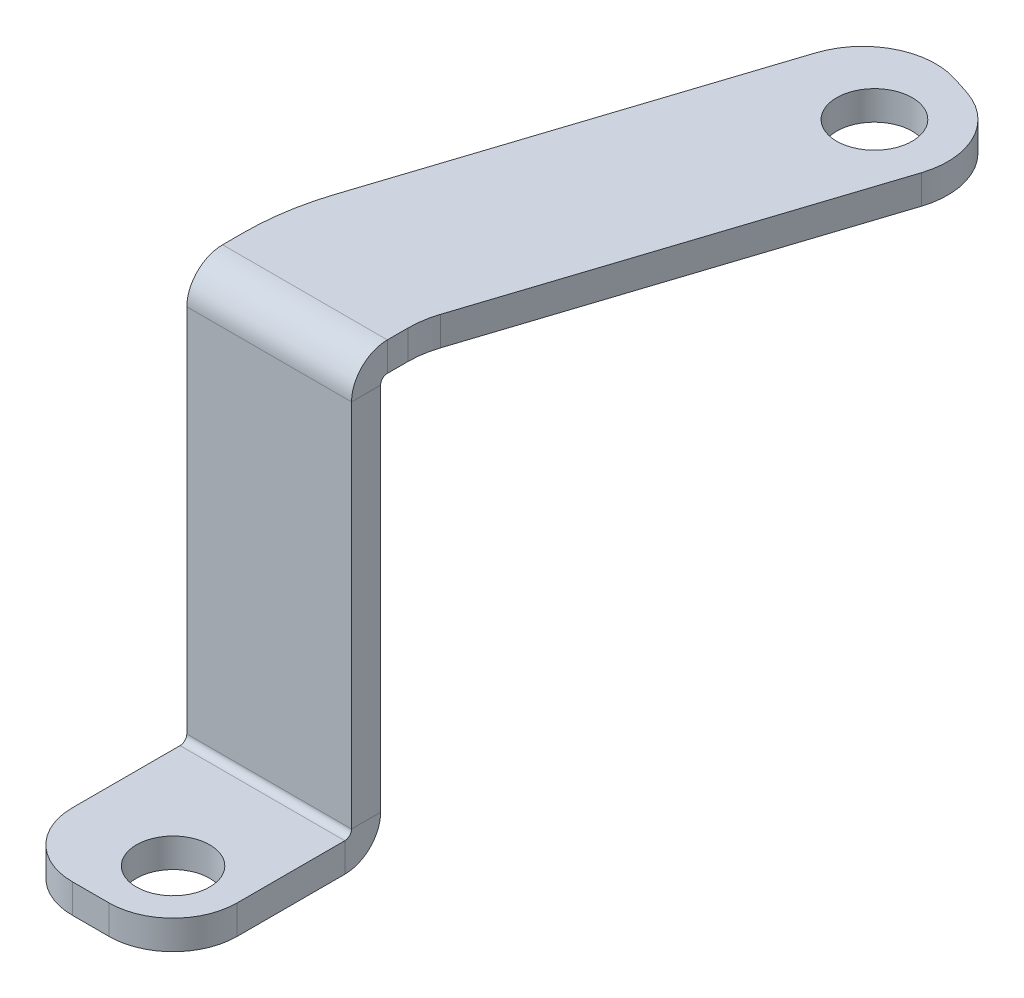
ISO-10303-21;
HEADER;
FILE_DESCRIPTION(('STEP AP214'),'2;1');
FILE_NAME('part.step','',(''),(''),'','','');
FILE_SCHEMA(('AUTOMOTIVE_DESIGN { 1 0 10303 214 1 1 1 1 }'));
ENDSEC;
DATA;
#1=APPLICATION_CONTEXT('core data for automotive mechanical design processes');
#2=APPLICATION_PROTOCOL_DEFINITION('international standard','automotive_design',2000,#1);
#3=PRODUCT_CONTEXT('',#1,'mechanical');
#4=PRODUCT('Part','Part','',(#3));
#5=PRODUCT_RELATED_PRODUCT_CATEGORY('part','',(#4));
#6=PRODUCT_DEFINITION_FORMATION('','',#4);
#7=PRODUCT_DEFINITION_CONTEXT('part definition',#1,'design');
#8=PRODUCT_DEFINITION('design','',#6,#7);
#9=PRODUCT_DEFINITION_SHAPE('','',#8);
#10=(LENGTH_UNIT() NAMED_UNIT(*) SI_UNIT(.MILLI.,.METRE.));
#11=(NAMED_UNIT(*) PLANE_ANGLE_UNIT() SI_UNIT($,.RADIAN.));
#12=(NAMED_UNIT(*) SI_UNIT($,.STERADIAN.) SOLID_ANGLE_UNIT());
#13=UNCERTAINTY_MEASURE_WITH_UNIT(LENGTH_MEASURE(1.E-05),#10,'distance_accuracy_value','');
#14=(GEOMETRIC_REPRESENTATION_CONTEXT(3) GLOBAL_UNCERTAINTY_ASSIGNED_CONTEXT((#13)) GLOBAL_UNIT_ASSIGNED_CONTEXT((#10,
#11,#12)) REPRESENTATION_CONTEXT('',''));
#15=CARTESIAN_POINT('',(0.,0.,0.));
#16=DIRECTION('',(0.,0.,1.));
#17=DIRECTION('',(1.,0.,0.));
#18=AXIS2_PLACEMENT_3D('',#15,#16,#17);
#19=CARTESIAN_POINT('',(7.,0.,-15.675));
#20=DIRECTION('',(-1.,0.,0.));
#21=DIRECTION('',(0.,0.,1.));
#22=AXIS2_PLACEMENT_3D('',#19,#20,#21);
#23=PLANE('',#22);
#24=DIRECTION('',(0.,0.,1.));
#25=VECTOR('',#24,1.);
#26=CARTESIAN_POINT('',(7.,41.1509000000002,-15.6750000000001));
#27=LINE('',#26,#25);
#28=CARTESIAN_POINT('',(7.,41.1509000000002,-15.6750000000001));
#29=VERTEX_POINT('',#28);
#30=CARTESIAN_POINT('',(7.,41.1509000000002,-12.5000000000001));
#31=VERTEX_POINT('',#30);
#32=EDGE_CURVE('E284',#29,#31,#27,.T.);
#33=ORIENTED_EDGE('',*,*,#32,.T.);
#34=DIRECTION('',(0.,-1.,0.));
#35=VECTOR('',#34,1.);
#36=CARTESIAN_POINT('',(7.,0.,-12.5));
#37=LINE('',#36,#35);
#38=CARTESIAN_POINT('',(7.,0.736599999999989,-12.5));
#39=VERTEX_POINT('',#38);
#40=EDGE_CURVE('E309',#31,#39,#37,.T.);
#41=ORIENTED_EDGE('',*,*,#40,.T.);
#42=DIRECTION('',(0.,0.,-1.));
#43=VECTOR('',#42,1.);
#44=CARTESIAN_POINT('',(7.,0.736599999999997,-12.5));
#45=LINE('',#44,#43);
#46=CARTESIAN_POINT('',(7.,0.736599999999978,-15.675));
#47=VERTEX_POINT('',#46);
#48=EDGE_CURVE('E296',#39,#47,#45,.T.);
#49=ORIENTED_EDGE('',*,*,#48,.T.);
#50=DIRECTION('',(0.,-1.,0.));
#51=VECTOR('',#50,1.);
#52=CARTESIAN_POINT('',(7.,0.,-15.675));
#53=LINE('',#52,#51);
#54=EDGE_CURVE('E310',#29,#47,#53,.T.);
#55=ORIENTED_EDGE('',*,*,#54,.F.);
#56=EDGE_LOOP('',(#33,#41,#49,#55));
#57=FACE_BOUND('',#56,.T.);
#58=ADVANCED_FACE('F43',(#57),#23,.F.);
#59=CARTESIAN_POINT('',(-11.,41.8875000000002,-15.6750000000001));
#60=DIRECTION('',(1.,0.,0.));
#61=DIRECTION('',(0.,1.,0.));
#62=AXIS2_PLACEMENT_3D('',#59,#60,#61);
#63=PLANE('',#62);
#64=DIRECTION('',(0.,0.,1.));
#65=VECTOR('',#64,1.);
#66=CARTESIAN_POINT('',(-11.,41.1509000000002,-15.6750000000001));
#67=LINE('',#66,#65);
#68=CARTESIAN_POINT('',(-11.,41.1509000000002,-15.6750000000001));
#69=VERTEX_POINT('',#68);
#70=CARTESIAN_POINT('',(-11.,41.1509000000002,-12.5000000000001));
#71=VERTEX_POINT('',#70);
#72=EDGE_CURVE('E294',#69,#71,#67,.T.);
#73=ORIENTED_EDGE('',*,*,#72,.F.);
#74=DIRECTION('',(0.,1.,0.));
#75=VECTOR('',#74,1.);
#76=CARTESIAN_POINT('',(-11.,41.8875000000002,-15.6750000000001));
#77=LINE('',#76,#75);
#78=CARTESIAN_POINT('',(-11.,0.736600000000019,-15.675));
#79=VERTEX_POINT('',#78);
#80=EDGE_CURVE('E312',#79,#69,#77,.T.);
#81=ORIENTED_EDGE('',*,*,#80,.F.);
#82=DIRECTION('',(0.,0.,-1.));
#83=VECTOR('',#82,1.);
#84=CARTESIAN_POINT('',(-11.,0.736599999999997,-12.5));
#85=LINE('',#84,#83);
#86=CARTESIAN_POINT('',(-11.,0.736599999999989,-12.5));
#87=VERTEX_POINT('',#86);
#88=EDGE_CURVE('E301',#87,#79,#85,.T.);
#89=ORIENTED_EDGE('',*,*,#88,.F.);
#90=DIRECTION('',(0.,1.,0.));
#91=VECTOR('',#90,1.);
#92=CARTESIAN_POINT('',(-11.,41.8875000000002,-12.5000000000001));
#93=LINE('',#92,#91);
#94=EDGE_CURVE('E313',#87,#71,#93,.T.);
#95=ORIENTED_EDGE('',*,*,#94,.T.);
#96=EDGE_LOOP('',(#73,#81,#89,#95));
#97=FACE_BOUND('',#96,.T.);
#98=ADVANCED_FACE('F410',(#97),#63,.F.);
#99=CARTESIAN_POINT('',(0.,0.,-15.675));
#100=DIRECTION('',(0.,0.,1.));
#101=DIRECTION('',(0.,-1.,0.));
#102=AXIS2_PLACEMENT_3D('',#99,#100,#101);
#103=PLANE('',#102);
#104=DIRECTION('',(1.,0.,0.));
#105=VECTOR('',#104,1.);
#106=CARTESIAN_POINT('',(7.,41.1509000000002,-15.6750000000001));
#107=LINE('',#106,#105);
#108=EDGE_CURVE('E290',#29,#69,#107,.F.);
#109=ORIENTED_EDGE('',*,*,#108,.F.);
#110=ORIENTED_EDGE('',*,*,#54,.T.);
#111=DIRECTION('',(1.,0.,0.));
#112=VECTOR('',#111,1.);
#113=CARTESIAN_POINT('',(0.,0.736600000000019,-15.675));
#114=LINE('',#113,#112);
#115=EDGE_CURVE('E304',#79,#47,#114,.T.);
#116=ORIENTED_EDGE('',*,*,#115,.F.);
#117=ORIENTED_EDGE('',*,*,#80,.T.);
#118=EDGE_LOOP('',(#109,#110,#116,#117));
#119=FACE_BOUND('',#118,.T.);
#120=ADVANCED_FACE('F405',(#119),#103,.F.);
#121=CARTESIAN_POINT('',(0.,0.,-12.5));
#122=DIRECTION('',(0.,0.,1.));
#123=DIRECTION('',(0.,-1.,0.));
#124=AXIS2_PLACEMENT_3D('',#121,#122,#123);
#125=PLANE('',#124);
#126=ORIENTED_EDGE('',*,*,#40,.F.);
#127=DIRECTION('',(1.,0.,0.));
#128=VECTOR('',#127,1.);
#129=CARTESIAN_POINT('',(7.,41.1509000000002,-12.5000000000001));
#130=LINE('',#129,#128);
#131=EDGE_CURVE('E279',#31,#71,#130,.F.);
#132=ORIENTED_EDGE('',*,*,#131,.T.);
#133=ORIENTED_EDGE('',*,*,#94,.F.);
#134=DIRECTION('',(-1.,0.,0.));
#135=VECTOR('',#134,1.);
#136=CARTESIAN_POINT('',(7.,0.736599999999997,-12.5));
#137=LINE('',#136,#135);
#138=EDGE_CURVE('E299',#39,#87,#137,.T.);
#139=ORIENTED_EDGE('',*,*,#138,.F.);
#140=EDGE_LOOP('',(#126,#132,#133,#139));
#141=FACE_BOUND('',#140,.T.);
#142=ADVANCED_FACE('F417',(#141),#125,.T.);
#143=CARTESIAN_POINT('',(-11.,-3.175,0.));
#144=DIRECTION('',(-1.,0.,0.));
#145=DIRECTION('',(0.,0.,1.));
#146=AXIS2_PLACEMENT_3D('',#143,#144,#145);
#147=PLANE('',#146);
#148=DIRECTION('',(0.,0.,1.));
#149=VECTOR('',#148,1.);
#150=CARTESIAN_POINT('',(-11.,0.,0.));
#151=LINE('',#150,#149);
#152=CARTESIAN_POINT('',(-11.,0.,-11.7634));
#153=VERTEX_POINT('',#152);
#154=CARTESIAN_POINT('',(-11.,0.,0.));
#155=VERTEX_POINT('',#154);
#156=EDGE_CURVE('E366',#153,#155,#151,.T.);
#157=ORIENTED_EDGE('',*,*,#156,.F.);
#158=DIRECTION('',(0.,-1.,0.));
#159=VECTOR('',#158,1.);
#160=CARTESIAN_POINT('',(-11.,0.,-11.7634));
#161=LINE('',#160,#159);
#162=CARTESIAN_POINT('',(-11.,-3.17500000000001,-11.7634));
#163=VERTEX_POINT('',#162);
#164=EDGE_CURVE('E326',#153,#163,#161,.T.);
#165=ORIENTED_EDGE('',*,*,#164,.T.);
#166=DIRECTION('',(0.,0.,1.));
#167=VECTOR('',#166,1.);
#168=CARTESIAN_POINT('',(-11.,-3.175,0.));
#169=LINE('',#168,#167);
#170=CARTESIAN_POINT('',(-11.,-3.175,0.));
#171=VERTEX_POINT('',#170);
#172=EDGE_CURVE('E354',#163,#171,#169,.T.);
#173=ORIENTED_EDGE('',*,*,#172,.T.);
#174=DIRECTION('',(0.,1.,0.));
#175=VECTOR('',#174,1.);
#176=CARTESIAN_POINT('',(-11.,-3.175,0.));
#177=LINE('',#176,#175);
#178=EDGE_CURVE('E373',#171,#155,#177,.T.);
#179=ORIENTED_EDGE('',*,*,#178,.T.);
#180=EDGE_LOOP('',(#157,#165,#173,#179));
#181=FACE_BOUND('',#180,.T.);
#182=ADVANCED_FACE('F432',(#181),#147,.T.);
#183=CARTESIAN_POINT('',(0.,-3.175,0.));
#184=DIRECTION('',(0.,1.,0.));
#185=DIRECTION('',(0.,0.,1.));
#186=AXIS2_PLACEMENT_3D('',#183,#184,#185);
#187=PLANE('',#186);
#188=CARTESIAN_POINT('',(0.,-3.175,0.));
#189=DIRECTION('',(0.,1.,0.));
#190=DIRECTION('',(0.,0.,1.));
#191=AXIS2_PLACEMENT_3D('',#188,#189,#190);
#192=CIRCLE('',#191,4.);
#193=CARTESIAN_POINT('',(0.,-3.175,4.));
#194=VERTEX_POINT('',#193);
#195=EDGE_CURVE('E341',#194,#194,#192,.T.);
#196=ORIENTED_EDGE('',*,*,#195,.T.);
#197=EDGE_LOOP('',(#196));
#198=FACE_BOUND('',#197,.T.);
#199=DIRECTION('',(-1.,0.,0.));
#200=VECTOR('',#199,1.);
#201=CARTESIAN_POINT('',(-11.,-3.17500000000001,-11.7634));
#202=LINE('',#201,#200);
#203=CARTESIAN_POINT('',(7.,-3.175,-11.7634));
#204=VERTEX_POINT('',#203);
#205=EDGE_CURVE('E320',#163,#204,#202,.F.);
#206=ORIENTED_EDGE('',*,*,#205,.T.);
#207=DIRECTION('',(0.,0.,-1.));
#208=VECTOR('',#207,1.);
#209=CARTESIAN_POINT('',(7.,-3.175,0.));
#210=LINE('',#209,#208);
#211=CARTESIAN_POINT('',(7.,-3.175,0.));
#212=VERTEX_POINT('',#211);
#213=EDGE_CURVE('E350',#212,#204,#210,.T.);
#214=ORIENTED_EDGE('',*,*,#213,.F.);
#215=CARTESIAN_POINT('',(0.,-3.175,0.));
#216=DIRECTION('',(0.,1.,0.));
#217=DIRECTION('',(0.,0.,1.));
#218=AXIS2_PLACEMENT_3D('',#215,#216,#217);
#219=CIRCLE('',#218,7.);
#220=CARTESIAN_POINT('',(0.,-3.175,7.));
#221=VERTEX_POINT('',#220);
#222=EDGE_CURVE('E347',#221,#212,#219,.T.);
#223=ORIENTED_EDGE('',*,*,#222,.F.);
#224=DIRECTION('',(1.,0.,0.));
#225=VECTOR('',#224,1.);
#226=CARTESIAN_POINT('',(0.,-3.175,7.));
#227=LINE('',#226,#225);
#228=CARTESIAN_POINT('',(-4.,-3.175,7.));
#229=VERTEX_POINT('',#228);
#230=EDGE_CURVE('E359',#229,#221,#227,.T.);
#231=ORIENTED_EDGE('',*,*,#230,.F.);
#232=CARTESIAN_POINT('',(-4.,-3.175,0.));
#233=DIRECTION('',(0.,1.,0.));
#234=DIRECTION('',(0.,0.,-1.));
#235=AXIS2_PLACEMENT_3D('',#232,#233,#234);
#236=CIRCLE('',#235,7.);
#237=EDGE_CURVE('E356',#171,#229,#236,.T.);
#238=ORIENTED_EDGE('',*,*,#237,.F.);
#239=ORIENTED_EDGE('',*,*,#172,.F.);
#240=EDGE_LOOP('',(#206,#214,#223,#231,#238,#239));
#241=FACE_BOUND('',#240,.T.);
#242=ADVANCED_FACE('F391',(#198,#241),#187,.F.);
#243=CARTESIAN_POINT('',(0.,0.,0.));
#244=DIRECTION('',(0.,1.,0.));
#245=DIRECTION('',(0.,0.,1.));
#246=AXIS2_PLACEMENT_3D('',#243,#244,#245);
#247=PLANE('',#246);
#248=CARTESIAN_POINT('',(0.,0.,0.));
#249=DIRECTION('',(0.,1.,0.));
#250=DIRECTION('',(0.,0.,1.));
#251=AXIS2_PLACEMENT_3D('',#248,#249,#250);
#252=CIRCLE('',#251,4.);
#253=CARTESIAN_POINT('',(0.,0.,4.));
#254=VERTEX_POINT('',#253);
#255=EDGE_CURVE('E338',#254,#254,#252,.T.);
#256=ORIENTED_EDGE('',*,*,#255,.F.);
#257=EDGE_LOOP('',(#256));
#258=FACE_BOUND('',#257,.T.);
#259=DIRECTION('',(0.,0.,-1.));
#260=VECTOR('',#259,1.);
#261=CARTESIAN_POINT('',(7.,0.,0.));
#262=LINE('',#261,#260);
#263=CARTESIAN_POINT('',(7.,0.,0.));
#264=VERTEX_POINT('',#263);
#265=CARTESIAN_POINT('',(7.,0.,-11.7634));
#266=VERTEX_POINT('',#265);
#267=EDGE_CURVE('E364',#264,#266,#262,.T.);
#268=ORIENTED_EDGE('',*,*,#267,.T.);
#269=DIRECTION('',(-1.,0.,0.));
#270=VECTOR('',#269,1.);
#271=CARTESIAN_POINT('',(-11.,0.,-11.7634));
#272=LINE('',#271,#270);
#273=EDGE_CURVE('E68',#153,#266,#272,.F.);
#274=ORIENTED_EDGE('',*,*,#273,.F.);
#275=ORIENTED_EDGE('',*,*,#156,.T.);
#276=CARTESIAN_POINT('',(-4.,0.,0.));
#277=DIRECTION('',(0.,1.,0.));
#278=DIRECTION('',(0.,0.,-1.));
#279=AXIS2_PLACEMENT_3D('',#276,#277,#278);
#280=CIRCLE('',#279,7.);
#281=CARTESIAN_POINT('',(-4.,0.,7.));
#282=VERTEX_POINT('',#281);
#283=EDGE_CURVE('E368',#155,#282,#280,.T.);
#284=ORIENTED_EDGE('',*,*,#283,.T.);
#285=DIRECTION('',(1.,0.,0.));
#286=VECTOR('',#285,1.);
#287=CARTESIAN_POINT('',(0.,0.,7.));
#288=LINE('',#287,#286);
#289=CARTESIAN_POINT('',(0.,0.,7.));
#290=VERTEX_POINT('',#289);
#291=EDGE_CURVE('E351',#282,#290,#288,.T.);
#292=ORIENTED_EDGE('',*,*,#291,.T.);
#293=CARTESIAN_POINT('',(0.,0.,0.));
#294=DIRECTION('',(0.,1.,0.));
#295=DIRECTION('',(0.,0.,1.));
#296=AXIS2_PLACEMENT_3D('',#293,#294,#295);
#297=CIRCLE('',#296,7.);
#298=EDGE_CURVE('E344',#290,#264,#297,.T.);
#299=ORIENTED_EDGE('',*,*,#298,.T.);
#300=EDGE_LOOP('',(#268,#274,#275,#284,#292,#299));
#301=FACE_BOUND('',#300,.T.);
#302=ADVANCED_FACE('F385',(#258,#301),#247,.T.);
#303=CARTESIAN_POINT('',(0.,-3.175,0.));
#304=DIRECTION('',(0.,1.,0.));
#305=DIRECTION('',(0.,0.,1.));
#306=AXIS2_PLACEMENT_3D('',#303,#304,#305);
#307=CYLINDRICAL_SURFACE('',#306,7.);
#308=ORIENTED_EDGE('',*,*,#298,.F.);
#309=DIRECTION('',(0.,1.,0.));
#310=VECTOR('',#309,1.);
#311=CARTESIAN_POINT('',(0.,-3.175,7.));
#312=LINE('',#311,#310);
#313=EDGE_CURVE('E11',#221,#290,#312,.T.);
#314=ORIENTED_EDGE('',*,*,#313,.F.);
#315=ORIENTED_EDGE('',*,*,#222,.T.);
#316=DIRECTION('',(0.,1.,0.));
#317=VECTOR('',#316,1.);
#318=CARTESIAN_POINT('',(7.,-3.175,0.));
#319=LINE('',#318,#317);
#320=EDGE_CURVE('E47',#212,#264,#319,.T.);
#321=ORIENTED_EDGE('',*,*,#320,.T.);
#322=EDGE_LOOP('',(#308,#314,#315,#321));
#323=FACE_BOUND('',#322,.T.);
#324=ADVANCED_FACE('F45',(#323),#307,.T.);
#325=CARTESIAN_POINT('',(0.,-3.175,7.));
#326=DIRECTION('',(0.,0.,1.));
#327=DIRECTION('',(1.,0.,0.));
#328=AXIS2_PLACEMENT_3D('',#325,#326,#327);
#329=PLANE('',#328);
#330=ORIENTED_EDGE('',*,*,#291,.F.);
#331=DIRECTION('',(0.,1.,0.));
#332=VECTOR('',#331,1.);
#333=CARTESIAN_POINT('',(-4.,-3.175,7.));
#334=LINE('',#333,#332);
#335=EDGE_CURVE('E52',#229,#282,#334,.T.);
#336=ORIENTED_EDGE('',*,*,#335,.F.);
#337=ORIENTED_EDGE('',*,*,#230,.T.);
#338=ORIENTED_EDGE('',*,*,#313,.T.);
#339=EDGE_LOOP('',(#330,#336,#337,#338));
#340=FACE_BOUND('',#339,.T.);
#341=ADVANCED_FACE('F388',(#340),#329,.T.);
#342=CARTESIAN_POINT('',(-4.,-3.175,0.));
#343=DIRECTION('',(0.,1.,0.));
#344=DIRECTION('',(0.,0.,1.));
#345=AXIS2_PLACEMENT_3D('',#342,#343,#344);
#346=CYLINDRICAL_SURFACE('',#345,7.);
#347=ORIENTED_EDGE('',*,*,#283,.F.);
#348=ORIENTED_EDGE('',*,*,#178,.F.);
#349=ORIENTED_EDGE('',*,*,#237,.T.);
#350=ORIENTED_EDGE('',*,*,#335,.T.);
#351=EDGE_LOOP('',(#347,#348,#349,#350));
#352=FACE_BOUND('',#351,.T.);
#353=ADVANCED_FACE('F434',(#352),#346,.T.);
#354=CARTESIAN_POINT('',(7.,-3.175,0.));
#355=DIRECTION('',(1.,0.,0.));
#356=DIRECTION('',(0.,0.,-1.));
#357=AXIS2_PLACEMENT_3D('',#354,#355,#356);
#358=PLANE('',#357);
#359=DIRECTION('',(0.,-1.,0.));
#360=VECTOR('',#359,1.);
#361=CARTESIAN_POINT('',(7.,0.,-11.7634));
#362=LINE('',#361,#360);
#363=EDGE_CURVE('E335',#266,#204,#362,.T.);
#364=ORIENTED_EDGE('',*,*,#363,.F.);
#365=ORIENTED_EDGE('',*,*,#267,.F.);
#366=ORIENTED_EDGE('',*,*,#320,.F.);
#367=ORIENTED_EDGE('',*,*,#213,.T.);
#368=EDGE_LOOP('',(#364,#365,#366,#367));
#369=FACE_BOUND('',#368,.T.);
#370=ADVANCED_FACE('F384',(#369),#358,.T.);
#371=CARTESIAN_POINT('',(0.,-3.175,0.));
#372=DIRECTION('',(0.,1.,0.));
#373=DIRECTION('',(0.,0.,1.));
#374=AXIS2_PLACEMENT_3D('',#371,#372,#373);
#375=CYLINDRICAL_SURFACE('',#374,4.);
#376=ORIENTED_EDGE('',*,*,#195,.F.);
#377=EDGE_LOOP('',(#376));
#378=FACE_BOUND('',#377,.T.);
#379=ORIENTED_EDGE('',*,*,#255,.T.);
#380=EDGE_LOOP('',(#379));
#381=FACE_BOUND('',#380,.T.);
#382=ADVANCED_FACE('F442',(#378,#381),#375,.F.);
#383=CARTESIAN_POINT('',(7.,0.736599999999992,-11.7634));
#384=DIRECTION('',(1.,0.,0.));
#385=DIRECTION('',(0.,0.,-1.));
#386=AXIS2_PLACEMENT_3D('',#383,#384,#385);
#387=PLANE('',#386);
#388=ORIENTED_EDGE('',*,*,#48,.F.);
#389=CARTESIAN_POINT('',(7.,0.736599999999992,-11.7634));
#390=DIRECTION('',(-1.,0.,0.));
#391=DIRECTION('',(0.,0.,1.));
#392=AXIS2_PLACEMENT_3D('',#389,#390,#391);
#393=CIRCLE('',#392,0.7366);
#394=EDGE_CURVE('E329',#266,#39,#393,.F.);
#395=ORIENTED_EDGE('',*,*,#394,.F.);
#396=ORIENTED_EDGE('',*,*,#363,.T.);
#397=CARTESIAN_POINT('',(7.,0.736599999999992,-11.7634));
#398=DIRECTION('',(-1.,0.,0.));
#399=DIRECTION('',(0.,0.,1.));
#400=AXIS2_PLACEMENT_3D('',#397,#398,#399);
#401=CIRCLE('',#400,3.9116);
#402=EDGE_CURVE('E322',#204,#47,#401,.F.);
#403=ORIENTED_EDGE('',*,*,#402,.T.);
#404=EDGE_LOOP('',(#388,#395,#396,#403));
#405=FACE_BOUND('',#404,.T.);
#406=ADVANCED_FACE('F398',(#405),#387,.T.);
#407=CARTESIAN_POINT('',(-11.,0.736599999999992,-11.7634));
#408=DIRECTION('',(1.,0.,0.));
#409=DIRECTION('',(0.,0.,-1.));
#410=AXIS2_PLACEMENT_3D('',#407,#408,#409);
#411=PLANE('',#410);
#412=CARTESIAN_POINT('',(-11.,0.736599999999992,-11.7634));
#413=DIRECTION('',(-1.,0.,0.));
#414=DIRECTION('',(0.,0.,1.));
#415=AXIS2_PLACEMENT_3D('',#412,#413,#414);
#416=CIRCLE('',#415,0.7366);
#417=EDGE_CURVE('E316',#87,#153,#416,.T.);
#418=ORIENTED_EDGE('',*,*,#417,.F.);
#419=ORIENTED_EDGE('',*,*,#88,.T.);
#420=CARTESIAN_POINT('',(-11.,0.736599999999992,-11.7634));
#421=DIRECTION('',(-1.,0.,0.));
#422=DIRECTION('',(0.,0.,1.));
#423=AXIS2_PLACEMENT_3D('',#420,#421,#422);
#424=CIRCLE('',#423,3.9116);
#425=EDGE_CURVE('E323',#79,#163,#424,.T.);
#426=ORIENTED_EDGE('',*,*,#425,.T.);
#427=ORIENTED_EDGE('',*,*,#164,.F.);
#428=EDGE_LOOP('',(#418,#419,#426,#427));
#429=FACE_BOUND('',#428,.T.);
#430=ADVANCED_FACE('F431',(#429),#411,.F.);
#431=CARTESIAN_POINT('',(-11.,0.736599999999992,-11.7634));
#432=DIRECTION('',(-1.,0.,0.));
#433=DIRECTION('',(0.,0.,-1.));
#434=AXIS2_PLACEMENT_3D('',#431,#432,#433);
#435=CYLINDRICAL_SURFACE('',#434,3.9116);
#436=ORIENTED_EDGE('',*,*,#205,.F.);
#437=ORIENTED_EDGE('',*,*,#425,.F.);
#438=ORIENTED_EDGE('',*,*,#115,.T.);
#439=ORIENTED_EDGE('',*,*,#402,.F.);
#440=EDGE_LOOP('',(#436,#437,#438,#439));
#441=FACE_BOUND('',#440,.T.);
#442=ADVANCED_FACE('F400',(#441),#435,.T.);
#443=CARTESIAN_POINT('',(-11.,0.736599999999992,-11.7634));
#444=DIRECTION('',(-1.,0.,0.));
#445=DIRECTION('',(0.,0.,-1.));
#446=AXIS2_PLACEMENT_3D('',#443,#444,#445);
#447=CYLINDRICAL_SURFACE('',#446,0.7366);
#448=ORIENTED_EDGE('',*,*,#273,.T.);
#449=ORIENTED_EDGE('',*,*,#394,.T.);
#450=ORIENTED_EDGE('',*,*,#138,.T.);
#451=ORIENTED_EDGE('',*,*,#417,.T.);
#452=EDGE_LOOP('',(#448,#449,#450,#451));
#453=FACE_BOUND('',#452,.T.);
#454=ADVANCED_FACE('F427',(#453),#447,.F.);
#455=CARTESIAN_POINT('',(-11.,41.1509000000002,-16.4116000000001));
#456=DIRECTION('',(-1.,0.,0.));
#457=DIRECTION('',(0.,0.,1.));
#458=AXIS2_PLACEMENT_3D('',#455,#456,#457);
#459=PLANE('',#458);
#460=DIRECTION('',(0.,1.,0.));
#461=VECTOR('',#460,1.);
#462=CARTESIAN_POINT('',(-11.,41.8875000000002,-16.4116000000001));
#463=LINE('',#462,#461);
#464=CARTESIAN_POINT('',(-11.,41.8875000000002,-16.4116000000001));
#465=VERTEX_POINT('',#464);
#466=CARTESIAN_POINT('',(-11.,45.0625000000002,-16.4116000000001));
#467=VERTEX_POINT('',#466);
#468=EDGE_CURVE('E248',#465,#467,#463,.T.);
#469=ORIENTED_EDGE('',*,*,#468,.F.);
#470=CARTESIAN_POINT('',(-11.,41.1509000000002,-16.4116000000001));
#471=DIRECTION('',(1.,0.,0.));
#472=DIRECTION('',(0.,0.,-1.));
#473=AXIS2_PLACEMENT_3D('',#470,#471,#472);
#474=CIRCLE('',#473,0.736599999999997);
#475=EDGE_CURVE('E287',#69,#465,#474,.F.);
#476=ORIENTED_EDGE('',*,*,#475,.F.);
#477=ORIENTED_EDGE('',*,*,#72,.T.);
#478=CARTESIAN_POINT('',(-11.,41.1509000000002,-16.4116000000001));
#479=DIRECTION('',(1.,0.,0.));
#480=DIRECTION('',(0.,0.,-1.));
#481=AXIS2_PLACEMENT_3D('',#478,#479,#480);
#482=CIRCLE('',#481,3.9116);
#483=EDGE_CURVE('E60',#71,#467,#482,.F.);
#484=ORIENTED_EDGE('',*,*,#483,.T.);
#485=EDGE_LOOP('',(#469,#476,#477,#484));
#486=FACE_BOUND('',#485,.T.);
#487=ADVANCED_FACE('F414',(#486),#459,.T.);
#488=CARTESIAN_POINT('',(7.,41.1509000000002,-16.4116000000001));
#489=DIRECTION('',(-1.,0.,0.));
#490=DIRECTION('',(0.,0.,1.));
#491=AXIS2_PLACEMENT_3D('',#488,#489,#490);
#492=PLANE('',#491);
#493=CARTESIAN_POINT('',(7.,41.1509000000002,-16.4116000000001));
#494=DIRECTION('',(1.,0.,0.));
#495=DIRECTION('',(0.,0.,-1.));
#496=AXIS2_PLACEMENT_3D('',#493,#494,#495);
#497=CIRCLE('',#496,0.736599999999997);
#498=CARTESIAN_POINT('',(7.,41.8875000000002,-16.4116000000001));
#499=VERTEX_POINT('',#498);
#500=EDGE_CURVE('E278',#499,#29,#497,.T.);
#501=ORIENTED_EDGE('',*,*,#500,.F.);
#502=DIRECTION('',(0.,1.,0.));
#503=VECTOR('',#502,1.);
#504=CARTESIAN_POINT('',(7.,41.8875000000002,-16.4116000000001));
#505=LINE('',#504,#503);
#506=CARTESIAN_POINT('',(7.,45.0625000000002,-16.4116000000001));
#507=VERTEX_POINT('',#506);
#508=EDGE_CURVE('E258',#499,#507,#505,.T.);
#509=ORIENTED_EDGE('',*,*,#508,.T.);
#510=CARTESIAN_POINT('',(7.,41.1509000000002,-16.4116000000001));
#511=DIRECTION('',(1.,0.,0.));
#512=DIRECTION('',(0.,0.,-1.));
#513=AXIS2_PLACEMENT_3D('',#510,#511,#512);
#514=CIRCLE('',#513,3.9116);
#515=EDGE_CURVE('E282',#507,#31,#514,.T.);
#516=ORIENTED_EDGE('',*,*,#515,.T.);
#517=ORIENTED_EDGE('',*,*,#32,.F.);
#518=EDGE_LOOP('',(#501,#509,#516,#517));
#519=FACE_BOUND('',#518,.T.);
#520=ADVANCED_FACE('F422',(#519),#492,.F.);
#521=CARTESIAN_POINT('',(7.,41.1509000000002,-16.4116000000001));
#522=DIRECTION('',(1.,0.,0.));
#523=DIRECTION('',(0.,1.,0.));
#524=AXIS2_PLACEMENT_3D('',#521,#522,#523);
#525=CYLINDRICAL_SURFACE('',#524,3.9116);
#526=ORIENTED_EDGE('',*,*,#131,.F.);
#527=ORIENTED_EDGE('',*,*,#515,.F.);
#528=DIRECTION('',(-1.,0.,0.));
#529=VECTOR('',#528,1.);
#530=CARTESIAN_POINT('',(0.,45.0625000000002,-16.4116000000001));
#531=LINE('',#530,#529);
#532=EDGE_CURVE('E261',#507,#467,#531,.T.);
#533=ORIENTED_EDGE('',*,*,#532,.T.);
#534=ORIENTED_EDGE('',*,*,#483,.F.);
#535=EDGE_LOOP('',(#526,#527,#533,#534));
#536=FACE_BOUND('',#535,.T.);
#537=ADVANCED_FACE('F419',(#536),#525,.T.);
#538=CARTESIAN_POINT('',(7.,41.1509000000002,-16.4116000000001));
#539=DIRECTION('',(1.,0.,0.));
#540=DIRECTION('',(0.,1.,0.));
#541=AXIS2_PLACEMENT_3D('',#538,#539,#540);
#542=CYLINDRICAL_SURFACE('',#541,0.736599999999997);
#543=ORIENTED_EDGE('',*,*,#108,.T.);
#544=ORIENTED_EDGE('',*,*,#475,.T.);
#545=DIRECTION('',(1.,0.,0.));
#546=VECTOR('',#545,1.);
#547=CARTESIAN_POINT('',(-11.,41.8875000000002,-16.4116000000001));
#548=LINE('',#547,#546);
#549=EDGE_CURVE('E256',#465,#499,#548,.T.);
#550=ORIENTED_EDGE('',*,*,#549,.T.);
#551=ORIENTED_EDGE('',*,*,#500,.T.);
#552=EDGE_LOOP('',(#543,#544,#550,#551));
#553=FACE_BOUND('',#552,.T.);
#554=ADVANCED_FACE('F600',(#553),#542,.F.);
#555=CARTESIAN_POINT('',(-11.,45.0625000000002,-15.6750000000001));
#556=DIRECTION('',(1.,0.,0.));
#557=DIRECTION('',(0.,0.,-1.));
#558=AXIS2_PLACEMENT_3D('',#555,#556,#557);
#559=PLANE('',#558);
#560=ORIENTED_EDGE('',*,*,#468,.T.);
#561=DIRECTION('',(0.,0.,1.));
#562=VECTOR('',#561,1.);
#563=CARTESIAN_POINT('',(-11.,45.0625000000002,-15.6750000000001));
#564=LINE('',#563,#562);
#565=CARTESIAN_POINT('',(-11.,45.0625000000002,-18.6750000000001));
#566=VERTEX_POINT('',#565);
#567=EDGE_CURVE('E266',#566,#467,#564,.T.);
#568=ORIENTED_EDGE('',*,*,#567,.F.);
#569=DIRECTION('',(0.,-1.,0.));
#570=VECTOR('',#569,1.);
#571=CARTESIAN_POINT('',(-11.,45.0625000000002,-18.6750000000001));
#572=LINE('',#571,#570);
#573=CARTESIAN_POINT('',(-11.,41.8875000000002,-18.6750000000001));
#574=VERTEX_POINT('',#573);
#575=EDGE_CURVE('E272',#566,#574,#572,.T.);
#576=ORIENTED_EDGE('',*,*,#575,.T.);
#577=DIRECTION('',(0.,0.,1.));
#578=VECTOR('',#577,1.);
#579=CARTESIAN_POINT('',(-11.,41.8875000000002,-15.6750000000001));
#580=LINE('',#579,#578);
#581=EDGE_CURVE('E265',#574,#465,#580,.T.);
#582=ORIENTED_EDGE('',*,*,#581,.T.);
#583=EDGE_LOOP('',(#560,#568,#576,#582));
#584=FACE_BOUND('',#583,.T.);
#585=ADVANCED_FACE('F610',(#584),#559,.F.);
#586=CARTESIAN_POINT('',(7.,45.0625000000002,-18.6750000000001));
#587=DIRECTION('',(-1.,0.,0.));
#588=DIRECTION('',(0.,0.,1.));
#589=AXIS2_PLACEMENT_3D('',#586,#587,#588);
#590=PLANE('',#589);
#591=ORIENTED_EDGE('',*,*,#508,.F.);
#592=DIRECTION('',(0.,0.,-1.));
#593=VECTOR('',#592,1.);
#594=CARTESIAN_POINT('',(7.,41.8875000000002,-18.6750000000001));
#595=LINE('',#594,#593);
#596=CARTESIAN_POINT('',(7.,41.8875000000002,-18.6750000000001));
#597=VERTEX_POINT('',#596);
#598=EDGE_CURVE('E270',#499,#597,#595,.T.);
#599=ORIENTED_EDGE('',*,*,#598,.T.);
#600=DIRECTION('',(0.,-1.,0.));
#601=VECTOR('',#600,1.);
#602=CARTESIAN_POINT('',(7.,45.0625000000002,-18.6750000000001));
#603=LINE('',#602,#601);
#604=CARTESIAN_POINT('',(7.,45.0625000000002,-18.6750000000001));
#605=VERTEX_POINT('',#604);
#606=EDGE_CURVE('E209',#605,#597,#603,.T.);
#607=ORIENTED_EDGE('',*,*,#606,.F.);
#608=DIRECTION('',(0.,0.,-1.));
#609=VECTOR('',#608,1.);
#610=CARTESIAN_POINT('',(7.,45.0625000000002,-18.6750000000001));
#611=LINE('',#610,#609);
#612=EDGE_CURVE('E269',#507,#605,#611,.T.);
#613=ORIENTED_EDGE('',*,*,#612,.F.);
#614=EDGE_LOOP('',(#591,#599,#607,#613));
#615=FACE_BOUND('',#614,.T.);
#616=ADVANCED_FACE('F621',(#615),#590,.F.);
#617=CARTESIAN_POINT('',(0.,45.0625000000002,0.));
#618=DIRECTION('',(0.,-1.,0.));
#619=DIRECTION('',(0.,0.,-1.));
#620=AXIS2_PLACEMENT_3D('',#617,#618,#619);
#621=PLANE('',#620);
#622=ORIENTED_EDGE('',*,*,#532,.F.);
#623=ORIENTED_EDGE('',*,*,#612,.T.);
#624=CARTESIAN_POINT('',(16.8624890031223,45.0625000000002,-18.6750000000001));
#625=DIRECTION('',(0.,-1.,0.));
#626=DIRECTION('',(0.,0.,1.));
#627=AXIS2_PLACEMENT_3D('',#624,#625,#626);
#628=CIRCLE('',#627,9.8624890031223);
#629=CARTESIAN_POINT('',(7.48144755123249,45.0625000000002,-21.7188052852695));
#630=VERTEX_POINT('',#629);
#631=EDGE_CURVE('E231',#605,#630,#628,.T.);
#632=ORIENTED_EDGE('',*,*,#631,.T.);
#633=DIRECTION('',(0.3086244541622,0.,-0.951183970792761));
#634=VECTOR('',#633,1.);
#635=CARTESIAN_POINT('',(20.3594662914687,45.0625000000002,-61.4090010428738));
#636=LINE('',#635,#634);
#637=CARTESIAN_POINT('',(20.3594662914692,45.0625000000002,-61.4090010428736));
#638=VERTEX_POINT('',#637);
#639=EDGE_CURVE('E187',#630,#638,#636,.T.);
#640=ORIENTED_EDGE('',*,*,#639,.T.);
#641=CARTESIAN_POINT('',(12.7499945251266,45.0625000000002,-63.8779966761711));
#642=DIRECTION('',(0.,1.,0.));
#643=DIRECTION('',(0.,0.,1.));
#644=AXIS2_PLACEMENT_3D('',#641,#642,#643);
#645=CIRCLE('',#644,8.0000000000004);
#646=CARTESIAN_POINT('',(15.2189901584242,45.0625000000002,-71.4874684425141));
#647=VERTEX_POINT('',#646);
#648=EDGE_CURVE('E235',#638,#647,#645,.T.);
#649=ORIENTED_EDGE('',*,*,#648,.T.);
#650=DIRECTION('',(-0.951183970792762,0.,-0.308624454162197));
#651=VECTOR('',#650,1.);
#652=CARTESIAN_POINT('',(15.2189901584242,45.0625000000002,-71.4874684425141));
#653=LINE('',#652,#651);
#654=CARTESIAN_POINT('',(13.3166222168389,45.0625000000002,-72.1047173508381));
#655=VERTEX_POINT('',#654);
#656=EDGE_CURVE('E238',#647,#655,#653,.T.);
#657=ORIENTED_EDGE('',*,*,#656,.T.);
#658=CARTESIAN_POINT('',(10.8476265835411,45.0625000000002,-64.4952455844958));
#659=DIRECTION('',(0.,1.,0.));
#660=DIRECTION('',(0.,0.,1.));
#661=AXIS2_PLACEMENT_3D('',#658,#659,#660);
#662=CIRCLE('',#661,8.00000000000029);
#663=CARTESIAN_POINT('',(3.23815481719903,45.0625000000002,-66.9642412177934));
#664=VERTEX_POINT('',#663);
#665=EDGE_CURVE('E241',#655,#664,#662,.T.);
#666=ORIENTED_EDGE('',*,*,#665,.T.);
#667=DIRECTION('',(-0.3086244541622,0.,0.951183970792761));
#668=VECTOR('',#667,1.);
#669=CARTESIAN_POINT('',(-9.63986392303721,45.0625000000002,-27.2740454601891));
#670=LINE('',#669,#668);
#671=CARTESIAN_POINT('',(-9.63986392303721,45.0625000000002,-27.2740454601891));
#672=VERTEX_POINT('',#671);
#673=EDGE_CURVE('E213',#664,#672,#670,.T.);
#674=ORIENTED_EDGE('',*,*,#673,.T.);
#675=CARTESIAN_POINT('',(16.8624890031223,45.0625000000002,-18.6750000000001));
#676=DIRECTION('',(0.,1.,0.));
#677=DIRECTION('',(0.,0.,-1.));
#678=AXIS2_PLACEMENT_3D('',#675,#676,#677);
#679=CIRCLE('',#678,27.8624890031223);
#680=EDGE_CURVE('E210',#672,#566,#679,.T.);
#681=ORIENTED_EDGE('',*,*,#680,.T.);
#682=ORIENTED_EDGE('',*,*,#567,.T.);
#683=EDGE_LOOP('',(#622,#623,#632,#640,#649,#657,#666,#674,#681,#682));
#684=FACE_BOUND('',#683,.T.);
#685=CARTESIAN_POINT('',(12.7499945251266,45.0625000000002,-63.8779966761711));
#686=DIRECTION('',(0.,1.,0.));
#687=DIRECTION('',(0.,0.,1.));
#688=AXIS2_PLACEMENT_3D('',#685,#686,#687);
#689=CIRCLE('',#688,4.12500000000001);
#690=CARTESIAN_POINT('',(12.7499945251266,45.0625000000002,-59.7529966761711));
#691=VERTEX_POINT('',#690);
#692=EDGE_CURVE('E216',#691,#691,#689,.T.);
#693=ORIENTED_EDGE('',*,*,#692,.F.);
#694=EDGE_LOOP('',(#693));
#695=FACE_BOUND('',#694,.T.);
#696=ADVANCED_FACE('F632',(#684,#695),#621,.F.);
#697=CARTESIAN_POINT('',(0.,41.8875000000002,0.));
#698=DIRECTION('',(0.,-1.,0.));
#699=DIRECTION('',(0.,0.,-1.));
#700=AXIS2_PLACEMENT_3D('',#697,#698,#699);
#701=PLANE('',#700);
#702=ORIENTED_EDGE('',*,*,#598,.F.);
#703=ORIENTED_EDGE('',*,*,#549,.F.);
#704=ORIENTED_EDGE('',*,*,#581,.F.);
#705=CARTESIAN_POINT('',(16.8624890031223,41.8875000000002,-18.6750000000001));
#706=DIRECTION('',(0.,1.,0.));
#707=DIRECTION('',(0.,0.,-1.));
#708=AXIS2_PLACEMENT_3D('',#705,#706,#707);
#709=CIRCLE('',#708,27.8624890031223);
#710=CARTESIAN_POINT('',(-9.63986392303721,41.8875000000002,-27.2740454601891));
#711=VERTEX_POINT('',#710);
#712=EDGE_CURVE('E193',#711,#574,#709,.T.);
#713=ORIENTED_EDGE('',*,*,#712,.F.);
#714=DIRECTION('',(-0.3086244541622,0.,0.951183970792761));
#715=VECTOR('',#714,1.);
#716=CARTESIAN_POINT('',(-9.63986392303721,41.8875000000002,-27.2740454601891));
#717=LINE('',#716,#715);
#718=CARTESIAN_POINT('',(3.23815481719903,41.8875000000002,-66.9642412177934));
#719=VERTEX_POINT('',#718);
#720=EDGE_CURVE('E226',#719,#711,#717,.T.);
#721=ORIENTED_EDGE('',*,*,#720,.F.);
#722=CARTESIAN_POINT('',(10.8476265835411,41.8875000000002,-64.4952455844958));
#723=DIRECTION('',(0.,1.,0.));
#724=DIRECTION('',(0.,0.,1.));
#725=AXIS2_PLACEMENT_3D('',#722,#723,#724);
#726=CIRCLE('',#725,8.00000000000029);
#727=CARTESIAN_POINT('',(13.3166222168389,41.8875000000002,-72.1047173508381));
#728=VERTEX_POINT('',#727);
#729=EDGE_CURVE('E223',#728,#719,#726,.T.);
#730=ORIENTED_EDGE('',*,*,#729,.F.);
#731=DIRECTION('',(-0.951183970792762,0.,-0.308624454162197));
#732=VECTOR('',#731,1.);
#733=CARTESIAN_POINT('',(15.2189901584242,41.8875000000002,-71.4874684425141));
#734=LINE('',#733,#732);
#735=CARTESIAN_POINT('',(15.2189901584242,41.8875000000002,-71.4874684425141));
#736=VERTEX_POINT('',#735);
#737=EDGE_CURVE('E220',#736,#728,#734,.T.);
#738=ORIENTED_EDGE('',*,*,#737,.F.);
#739=CARTESIAN_POINT('',(12.7499945251266,41.8875000000002,-63.8779966761711));
#740=DIRECTION('',(0.,1.,0.));
#741=DIRECTION('',(0.,0.,1.));
#742=AXIS2_PLACEMENT_3D('',#739,#740,#741);
#743=CIRCLE('',#742,8.0000000000004);
#744=CARTESIAN_POINT('',(20.3594662914692,41.8875000000002,-61.4090010428736));
#745=VERTEX_POINT('',#744);
#746=EDGE_CURVE('E204',#745,#736,#743,.T.);
#747=ORIENTED_EDGE('',*,*,#746,.F.);
#748=DIRECTION('',(0.3086244541622,0.,-0.951183970792761));
#749=VECTOR('',#748,1.);
#750=CARTESIAN_POINT('',(20.3594662914687,41.8875000000002,-61.4090010428738));
#751=LINE('',#750,#749);
#752=CARTESIAN_POINT('',(7.48144755123249,41.8875000000002,-21.7188052852695));
#753=VERTEX_POINT('',#752);
#754=EDGE_CURVE('E185',#753,#745,#751,.T.);
#755=ORIENTED_EDGE('',*,*,#754,.F.);
#756=CARTESIAN_POINT('',(16.8624890031223,41.8875000000002,-18.6750000000001));
#757=DIRECTION('',(0.,-1.,0.));
#758=DIRECTION('',(0.,0.,1.));
#759=AXIS2_PLACEMENT_3D('',#756,#757,#758);
#760=CIRCLE('',#759,9.8624890031223);
#761=EDGE_CURVE('E201',#597,#753,#760,.T.);
#762=ORIENTED_EDGE('',*,*,#761,.F.);
#763=EDGE_LOOP('',(#702,#703,#704,#713,#721,#730,#738,#747,#755,#762));
#764=FACE_BOUND('',#763,.T.);
#765=CARTESIAN_POINT('',(12.7499945251266,41.8875000000002,-63.8779966761711));
#766=DIRECTION('',(0.,1.,0.));
#767=DIRECTION('',(0.,0.,1.));
#768=AXIS2_PLACEMENT_3D('',#765,#766,#767);
#769=CIRCLE('',#768,4.12500000000001);
#770=CARTESIAN_POINT('',(12.7499945251266,41.8875000000002,-59.7529966761711));
#771=VERTEX_POINT('',#770);
#772=EDGE_CURVE('E233',#771,#771,#769,.T.);
#773=ORIENTED_EDGE('',*,*,#772,.T.);
#774=EDGE_LOOP('',(#773));
#775=FACE_BOUND('',#774,.T.);
#776=ADVANCED_FACE('F199',(#764,#775),#701,.T.);
#777=CARTESIAN_POINT('',(16.8624890031223,41.8875000000002,-18.6750000000001));
#778=DIRECTION('',(0.,1.,0.));
#779=DIRECTION('',(0.,0.,1.));
#780=AXIS2_PLACEMENT_3D('',#777,#778,#779);
#781=CYLINDRICAL_SURFACE('',#780,9.8624890031223);
#782=ORIENTED_EDGE('',*,*,#631,.F.);
#783=ORIENTED_EDGE('',*,*,#606,.T.);
#784=ORIENTED_EDGE('',*,*,#761,.T.);
#785=DIRECTION('',(0.,1.,0.));
#786=VECTOR('',#785,1.);
#787=CARTESIAN_POINT('',(7.48144755123249,41.8875000000002,-21.7188052852695));
#788=LINE('',#787,#786);
#789=EDGE_CURVE('E182',#753,#630,#788,.T.);
#790=ORIENTED_EDGE('',*,*,#789,.T.);
#791=EDGE_LOOP('',(#782,#783,#784,#790));
#792=FACE_BOUND('',#791,.T.);
#793=ADVANCED_FACE('F207',(#792),#781,.F.);
#794=CARTESIAN_POINT('',(16.8624890031223,41.8875000000002,-18.6750000000001));
#795=DIRECTION('',(0.,1.,0.));
#796=DIRECTION('',(0.,0.,1.));
#797=AXIS2_PLACEMENT_3D('',#794,#795,#796);
#798=CYLINDRICAL_SURFACE('',#797,27.8624890031223);
#799=ORIENTED_EDGE('',*,*,#680,.F.);
#800=DIRECTION('',(0.,1.,0.));
#801=VECTOR('',#800,1.);
#802=CARTESIAN_POINT('',(-9.63986392303721,41.8875000000002,-27.2740454601891));
#803=LINE('',#802,#801);
#804=EDGE_CURVE('E246',#711,#672,#803,.T.);
#805=ORIENTED_EDGE('',*,*,#804,.F.);
#806=ORIENTED_EDGE('',*,*,#712,.T.);
#807=ORIENTED_EDGE('',*,*,#575,.F.);
#808=EDGE_LOOP('',(#799,#805,#806,#807));
#809=FACE_BOUND('',#808,.T.);
#810=ADVANCED_FACE('F667',(#809),#798,.T.);
#811=CARTESIAN_POINT('',(-9.63986392303721,41.8875000000002,-27.2740454601891));
#812=DIRECTION('',(-0.951183970792761,0.,-0.3086244541622));
#813=DIRECTION('',(-0.3086244541622,0.,0.951183970792761));
#814=AXIS2_PLACEMENT_3D('',#811,#812,#813);
#815=PLANE('',#814);
#816=ORIENTED_EDGE('',*,*,#673,.F.);
#817=DIRECTION('',(0.,1.,0.));
#818=VECTOR('',#817,1.);
#819=CARTESIAN_POINT('',(3.23815481719903,41.8875000000002,-66.9642412177934));
#820=LINE('',#819,#818);
#821=EDGE_CURVE('E249',#719,#664,#820,.T.);
#822=ORIENTED_EDGE('',*,*,#821,.F.);
#823=ORIENTED_EDGE('',*,*,#720,.T.);
#824=ORIENTED_EDGE('',*,*,#804,.T.);
#825=EDGE_LOOP('',(#816,#822,#823,#824));
#826=FACE_BOUND('',#825,.T.);
#827=ADVANCED_FACE('F676',(#826),#815,.T.);
#828=CARTESIAN_POINT('',(10.8476265835411,41.8875000000002,-64.4952455844958));
#829=DIRECTION('',(0.,1.,0.));
#830=DIRECTION('',(0.,0.,1.));
#831=AXIS2_PLACEMENT_3D('',#828,#829,#830);
#832=CYLINDRICAL_SURFACE('',#831,8.00000000000029);
#833=ORIENTED_EDGE('',*,*,#665,.F.);
#834=DIRECTION('',(0.,1.,0.));
#835=VECTOR('',#834,1.);
#836=CARTESIAN_POINT('',(13.3166222168389,41.8875000000002,-72.1047173508381));
#837=LINE('',#836,#835);
#838=EDGE_CURVE('E251',#728,#655,#837,.T.);
#839=ORIENTED_EDGE('',*,*,#838,.F.);
#840=ORIENTED_EDGE('',*,*,#729,.T.);
#841=ORIENTED_EDGE('',*,*,#821,.T.);
#842=EDGE_LOOP('',(#833,#839,#840,#841));
#843=FACE_BOUND('',#842,.T.);
#844=ADVANCED_FACE('F686',(#843),#832,.T.);
#845=CARTESIAN_POINT('',(15.2189901584242,41.8875000000002,-71.4874684425141));
#846=DIRECTION('',(0.308624454162197,0.,-0.951183970792762));
#847=DIRECTION('',(-0.951183970792762,0.,-0.308624454162197));
#848=AXIS2_PLACEMENT_3D('',#845,#846,#847);
#849=PLANE('',#848);
#850=ORIENTED_EDGE('',*,*,#656,.F.);
#851=DIRECTION('',(0.,1.,0.));
#852=VECTOR('',#851,1.);
#853=CARTESIAN_POINT('',(15.2189901584242,41.8875000000002,-71.4874684425141));
#854=LINE('',#853,#852);
#855=EDGE_CURVE('E253',#736,#647,#854,.T.);
#856=ORIENTED_EDGE('',*,*,#855,.F.);
#857=ORIENTED_EDGE('',*,*,#737,.T.);
#858=ORIENTED_EDGE('',*,*,#838,.T.);
#859=EDGE_LOOP('',(#850,#856,#857,#858));
#860=FACE_BOUND('',#859,.T.);
#861=ADVANCED_FACE('F696',(#860),#849,.T.);
#862=CARTESIAN_POINT('',(12.7499945251266,41.8875000000002,-63.8779966761711));
#863=DIRECTION('',(0.,1.,0.));
#864=DIRECTION('',(0.,0.,1.));
#865=AXIS2_PLACEMENT_3D('',#862,#863,#864);
#866=CYLINDRICAL_SURFACE('',#865,8.0000000000004);
#867=ORIENTED_EDGE('',*,*,#648,.F.);
#868=DIRECTION('',(0.,1.,0.));
#869=VECTOR('',#868,1.);
#870=CARTESIAN_POINT('',(20.3594662914692,41.8875000000002,-61.4090010428736));
#871=LINE('',#870,#869);
#872=EDGE_CURVE('E192',#745,#638,#871,.T.);
#873=ORIENTED_EDGE('',*,*,#872,.F.);
#874=ORIENTED_EDGE('',*,*,#746,.T.);
#875=ORIENTED_EDGE('',*,*,#855,.T.);
#876=EDGE_LOOP('',(#867,#873,#874,#875));
#877=FACE_BOUND('',#876,.T.);
#878=ADVANCED_FACE('F706',(#877),#866,.T.);
#879=CARTESIAN_POINT('',(20.3594662914687,41.8875000000002,-61.4090010428738));
#880=DIRECTION('',(0.951183970792761,0.,0.3086244541622));
#881=DIRECTION('',(0.3086244541622,0.,-0.951183970792761));
#882=AXIS2_PLACEMENT_3D('',#879,#880,#881);
#883=PLANE('',#882);
#884=ORIENTED_EDGE('',*,*,#639,.F.);
#885=ORIENTED_EDGE('',*,*,#789,.F.);
#886=ORIENTED_EDGE('',*,*,#754,.T.);
#887=ORIENTED_EDGE('',*,*,#872,.T.);
#888=EDGE_LOOP('',(#884,#885,#886,#887));
#889=FACE_BOUND('',#888,.T.);
#890=ADVANCED_FACE('F184',(#889),#883,.T.);
#891=CARTESIAN_POINT('',(12.7499945251266,41.8875000000002,-63.8779966761711));
#892=DIRECTION('',(0.,1.,0.));
#893=DIRECTION('',(0.,0.,1.));
#894=AXIS2_PLACEMENT_3D('',#891,#892,#893);
#895=CYLINDRICAL_SURFACE('',#894,4.12500000000001);
#896=ORIENTED_EDGE('',*,*,#772,.F.);
#897=EDGE_LOOP('',(#896));
#898=FACE_BOUND('',#897,.T.);
#899=ORIENTED_EDGE('',*,*,#692,.T.);
#900=EDGE_LOOP('',(#899));
#901=FACE_BOUND('',#900,.T.);
#902=ADVANCED_FACE('F725',(#898,#901),#895,.F.);
#903=CLOSED_SHELL('',(#58,#98,#120,#142,#182,#242,#302,#324,#341,#353,#370,#382,#406,#430,#442,
#454,#487,#520,#537,#554,#585,#616,#696,#776,#793,#810,#827,#844,#861,#878,#890,#902));
#904=MANIFOLD_SOLID_BREP('B2',#903);
#905=ADVANCED_BREP_SHAPE_REPRESENTATION('',(#18,#904),#14);
#906=SHAPE_DEFINITION_REPRESENTATION(#9,#905);
ENDSEC;
END-ISO-10303-21;
